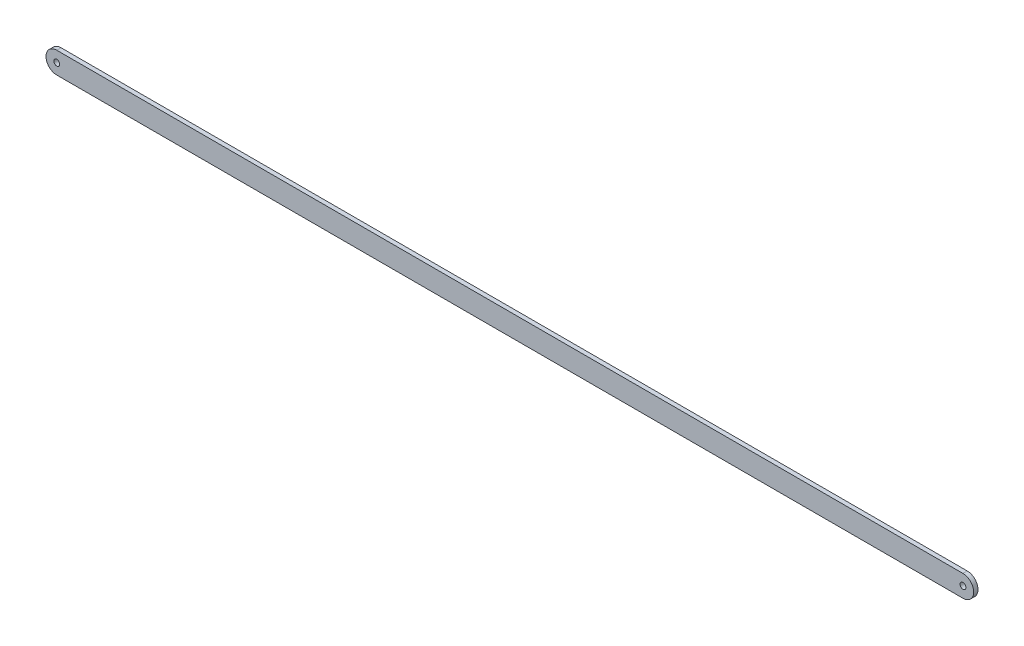
ISO-10303-21;
HEADER;
FILE_DESCRIPTION(('STEP AP214'),'2;1');
FILE_NAME('part.step','',(''),(''),'','','');
FILE_SCHEMA(('AUTOMOTIVE_DESIGN { 1 0 10303 214 1 1 1 1 }'));
ENDSEC;
DATA;
#1=APPLICATION_CONTEXT('core data for automotive mechanical design processes');
#2=APPLICATION_PROTOCOL_DEFINITION('international standard','automotive_design',2000,#1);
#3=PRODUCT_CONTEXT('',#1,'mechanical');
#4=PRODUCT('Part','Part','',(#3));
#5=PRODUCT_RELATED_PRODUCT_CATEGORY('part','',(#4));
#6=PRODUCT_DEFINITION_FORMATION('','',#4);
#7=PRODUCT_DEFINITION_CONTEXT('part definition',#1,'design');
#8=PRODUCT_DEFINITION('design','',#6,#7);
#9=PRODUCT_DEFINITION_SHAPE('','',#8);
#10=(LENGTH_UNIT() NAMED_UNIT(*) SI_UNIT(.MILLI.,.METRE.));
#11=(NAMED_UNIT(*) PLANE_ANGLE_UNIT() SI_UNIT($,.RADIAN.));
#12=(NAMED_UNIT(*) SI_UNIT($,.STERADIAN.) SOLID_ANGLE_UNIT());
#13=UNCERTAINTY_MEASURE_WITH_UNIT(LENGTH_MEASURE(1.E-05),#10,'distance_accuracy_value','');
#14=(GEOMETRIC_REPRESENTATION_CONTEXT(3) GLOBAL_UNCERTAINTY_ASSIGNED_CONTEXT((#13)) GLOBAL_UNIT_ASSIGNED_CONTEXT((#10,
#11,#12)) REPRESENTATION_CONTEXT('',''));
#15=CARTESIAN_POINT('',(0.,0.,0.));
#16=DIRECTION('',(0.,0.,1.));
#17=DIRECTION('',(1.,0.,0.));
#18=AXIS2_PLACEMENT_3D('',#15,#16,#17);
#19=CARTESIAN_POINT('',(421.355,0.,4.));
#20=DIRECTION('',(0.,0.,-1.));
#21=DIRECTION('',(-1.,0.,0.));
#22=AXIS2_PLACEMENT_3D('',#19,#20,#21);
#23=PLANE('',#22);
#24=CARTESIAN_POINT('',(421.355,0.,4.));
#25=DIRECTION('',(0.,0.,1.));
#26=DIRECTION('',(-1.,0.,0.));
#27=AXIS2_PLACEMENT_3D('',#24,#25,#26);
#28=CIRCLE('',#27,10.);
#29=CARTESIAN_POINT('',(421.355,-10.,4.));
#30=VERTEX_POINT('',#29);
#31=CARTESIAN_POINT('',(421.355,9.99999999999995,4.));
#32=VERTEX_POINT('',#31);
#33=EDGE_CURVE('E84',#30,#32,#28,.T.);
#34=ORIENTED_EDGE('',*,*,#33,.T.);
#35=DIRECTION('',(-1.,0.,0.));
#36=VECTOR('',#35,1.);
#37=CARTESIAN_POINT('',(-421.355,9.99999999999984,4.));
#38=LINE('',#37,#36);
#39=CARTESIAN_POINT('',(-421.355,9.99999999999984,4.));
#40=VERTEX_POINT('',#39);
#41=EDGE_CURVE('E79',#32,#40,#38,.T.);
#42=ORIENTED_EDGE('',*,*,#41,.T.);
#43=CARTESIAN_POINT('',(-421.355,-1.60642431554755E-13,4.));
#44=DIRECTION('',(0.,0.,1.));
#45=DIRECTION('',(1.,0.,0.));
#46=AXIS2_PLACEMENT_3D('',#43,#44,#45);
#47=CIRCLE('',#46,9.99999999999999);
#48=CARTESIAN_POINT('',(-421.355,-10.0000000000002,4.));
#49=VERTEX_POINT('',#48);
#50=EDGE_CURVE('E82',#40,#49,#47,.T.);
#51=ORIENTED_EDGE('',*,*,#50,.T.);
#52=DIRECTION('',(1.,0.,0.));
#53=VECTOR('',#52,1.);
#54=CARTESIAN_POINT('',(-421.355,-10.0000000000002,4.));
#55=LINE('',#54,#53);
#56=EDGE_CURVE('E49',#49,#30,#55,.T.);
#57=ORIENTED_EDGE('',*,*,#56,.T.);
#58=EDGE_LOOP('',(#34,#42,#51,#57));
#59=FACE_BOUND('',#58,.T.);
#60=CARTESIAN_POINT('',(-421.355,-1.60642431554755E-13,4.));
#61=DIRECTION('',(0.,0.,1.));
#62=DIRECTION('',(1.,0.,0.));
#63=AXIS2_PLACEMENT_3D('',#60,#61,#62);
#64=CIRCLE('',#63,2.75000000000004);
#65=CARTESIAN_POINT('',(-418.605,-1.60642431554755E-13,4.));
#66=VERTEX_POINT('',#65);
#67=EDGE_CURVE('E99',#66,#66,#64,.T.);
#68=ORIENTED_EDGE('',*,*,#67,.F.);
#69=EDGE_LOOP('',(#68));
#70=FACE_BOUND('',#69,.T.);
#71=CARTESIAN_POINT('',(421.355,0.,4.));
#72=DIRECTION('',(0.,0.,1.));
#73=DIRECTION('',(-1.,0.,0.));
#74=AXIS2_PLACEMENT_3D('',#71,#72,#73);
#75=CIRCLE('',#74,2.75000000000004);
#76=CARTESIAN_POINT('',(418.605,0.,4.));
#77=VERTEX_POINT('',#76);
#78=EDGE_CURVE('E114',#77,#77,#75,.T.);
#79=ORIENTED_EDGE('',*,*,#78,.F.);
#80=EDGE_LOOP('',(#79));
#81=FACE_BOUND('',#80,.T.);
#82=ADVANCED_FACE('F32',(#59,#70,#81),#23,.F.);
#83=CARTESIAN_POINT('',(421.355,0.,0.));
#84=DIRECTION('',(0.,0.,-1.));
#85=DIRECTION('',(-1.,0.,0.));
#86=AXIS2_PLACEMENT_3D('',#83,#84,#85);
#87=PLANE('',#86);
#88=CARTESIAN_POINT('',(-421.355,-1.60642431554755E-13,0.));
#89=DIRECTION('',(0.,0.,1.));
#90=DIRECTION('',(1.,0.,0.));
#91=AXIS2_PLACEMENT_3D('',#88,#89,#90);
#92=CIRCLE('',#91,2.75000000000004);
#93=CARTESIAN_POINT('',(-418.605,-1.60642431554755E-13,0.));
#94=VERTEX_POINT('',#93);
#95=EDGE_CURVE('E111',#94,#94,#92,.T.);
#96=ORIENTED_EDGE('',*,*,#95,.T.);
#97=EDGE_LOOP('',(#96));
#98=FACE_BOUND('',#97,.T.);
#99=CARTESIAN_POINT('',(421.355,0.,0.));
#100=DIRECTION('',(0.,0.,1.));
#101=DIRECTION('',(-1.,0.,0.));
#102=AXIS2_PLACEMENT_3D('',#99,#100,#101);
#103=CIRCLE('',#102,10.);
#104=CARTESIAN_POINT('',(421.355,-10.,0.));
#105=VERTEX_POINT('',#104);
#106=CARTESIAN_POINT('',(421.355,9.99999999999995,0.));
#107=VERTEX_POINT('',#106);
#108=EDGE_CURVE('E96',#105,#107,#103,.T.);
#109=ORIENTED_EDGE('',*,*,#108,.F.);
#110=DIRECTION('',(1.,0.,0.));
#111=VECTOR('',#110,1.);
#112=CARTESIAN_POINT('',(-421.355,-10.0000000000002,0.));
#113=LINE('',#112,#111);
#114=CARTESIAN_POINT('',(-421.355,-10.0000000000002,0.));
#115=VERTEX_POINT('',#114);
#116=EDGE_CURVE('E72',#115,#105,#113,.T.);
#117=ORIENTED_EDGE('',*,*,#116,.F.);
#118=CARTESIAN_POINT('',(-421.355,-1.60642431554755E-13,0.));
#119=DIRECTION('',(0.,0.,1.));
#120=DIRECTION('',(1.,0.,0.));
#121=AXIS2_PLACEMENT_3D('',#118,#119,#120);
#122=CIRCLE('',#121,9.99999999999999);
#123=CARTESIAN_POINT('',(-421.355,9.99999999999984,0.));
#124=VERTEX_POINT('',#123);
#125=EDGE_CURVE('E66',#124,#115,#122,.T.);
#126=ORIENTED_EDGE('',*,*,#125,.F.);
#127=DIRECTION('',(-1.,0.,0.));
#128=VECTOR('',#127,1.);
#129=CARTESIAN_POINT('',(-421.355,9.99999999999984,0.));
#130=LINE('',#129,#128);
#131=EDGE_CURVE('E88',#107,#124,#130,.T.);
#132=ORIENTED_EDGE('',*,*,#131,.F.);
#133=EDGE_LOOP('',(#109,#117,#126,#132));
#134=FACE_BOUND('',#133,.T.);
#135=CARTESIAN_POINT('',(421.355,0.,0.));
#136=DIRECTION('',(0.,0.,1.));
#137=DIRECTION('',(-1.,0.,0.));
#138=AXIS2_PLACEMENT_3D('',#135,#136,#137);
#139=CIRCLE('',#138,2.75000000000004);
#140=CARTESIAN_POINT('',(418.605,0.,0.));
#141=VERTEX_POINT('',#140);
#142=EDGE_CURVE('E117',#141,#141,#139,.T.);
#143=ORIENTED_EDGE('',*,*,#142,.T.);
#144=EDGE_LOOP('',(#143));
#145=FACE_BOUND('',#144,.T.);
#146=ADVANCED_FACE('F107',(#98,#134,#145),#87,.T.);
#147=CARTESIAN_POINT('',(421.355,0.,4.));
#148=DIRECTION('',(0.,0.,-1.));
#149=DIRECTION('',(-1.,0.,0.));
#150=AXIS2_PLACEMENT_3D('',#147,#148,#149);
#151=CYLINDRICAL_SURFACE('',#150,10.);
#152=ORIENTED_EDGE('',*,*,#108,.T.);
#153=DIRECTION('',(0.,0.,-1.));
#154=VECTOR('',#153,1.);
#155=CARTESIAN_POINT('',(421.355,9.99999999999995,4.));
#156=LINE('',#155,#154);
#157=EDGE_CURVE('E11',#32,#107,#156,.T.);
#158=ORIENTED_EDGE('',*,*,#157,.F.);
#159=ORIENTED_EDGE('',*,*,#33,.F.);
#160=DIRECTION('',(0.,0.,-1.));
#161=VECTOR('',#160,1.);
#162=CARTESIAN_POINT('',(421.355,-10.,4.));
#163=LINE('',#162,#161);
#164=EDGE_CURVE('E92',#30,#105,#163,.T.);
#165=ORIENTED_EDGE('',*,*,#164,.T.);
#166=EDGE_LOOP('',(#152,#158,#159,#165));
#167=FACE_BOUND('',#166,.T.);
#168=ADVANCED_FACE('F34',(#167),#151,.T.);
#169=CARTESIAN_POINT('',(-421.355,9.99999999999984,4.));
#170=DIRECTION('',(0.,-1.,0.));
#171=DIRECTION('',(1.,0.,0.));
#172=AXIS2_PLACEMENT_3D('',#169,#170,#171);
#173=PLANE('',#172);
#174=ORIENTED_EDGE('',*,*,#131,.T.);
#175=DIRECTION('',(0.,0.,-1.));
#176=VECTOR('',#175,1.);
#177=CARTESIAN_POINT('',(-421.355,9.99999999999984,4.));
#178=LINE('',#177,#176);
#179=EDGE_CURVE('E41',#40,#124,#178,.T.);
#180=ORIENTED_EDGE('',*,*,#179,.F.);
#181=ORIENTED_EDGE('',*,*,#41,.F.);
#182=ORIENTED_EDGE('',*,*,#157,.T.);
#183=EDGE_LOOP('',(#174,#180,#181,#182));
#184=FACE_BOUND('',#183,.T.);
#185=ADVANCED_FACE('F87',(#184),#173,.F.);
#186=CARTESIAN_POINT('',(-421.355,-1.60642431554755E-13,4.));
#187=DIRECTION('',(0.,0.,-1.));
#188=DIRECTION('',(-1.,0.,0.));
#189=AXIS2_PLACEMENT_3D('',#186,#187,#188);
#190=CYLINDRICAL_SURFACE('',#189,9.99999999999999);
#191=ORIENTED_EDGE('',*,*,#125,.T.);
#192=DIRECTION('',(0.,0.,-1.));
#193=VECTOR('',#192,1.);
#194=CARTESIAN_POINT('',(-421.355,-10.0000000000002,4.));
#195=LINE('',#194,#193);
#196=EDGE_CURVE('E89',#49,#115,#195,.T.);
#197=ORIENTED_EDGE('',*,*,#196,.F.);
#198=ORIENTED_EDGE('',*,*,#50,.F.);
#199=ORIENTED_EDGE('',*,*,#179,.T.);
#200=EDGE_LOOP('',(#191,#197,#198,#199));
#201=FACE_BOUND('',#200,.T.);
#202=ADVANCED_FACE('F90',(#201),#190,.T.);
#203=CARTESIAN_POINT('',(-421.355,-10.0000000000002,4.));
#204=DIRECTION('',(0.,1.,0.));
#205=DIRECTION('',(-1.,0.,0.));
#206=AXIS2_PLACEMENT_3D('',#203,#204,#205);
#207=PLANE('',#206);
#208=ORIENTED_EDGE('',*,*,#116,.T.);
#209=ORIENTED_EDGE('',*,*,#164,.F.);
#210=ORIENTED_EDGE('',*,*,#56,.F.);
#211=ORIENTED_EDGE('',*,*,#196,.T.);
#212=EDGE_LOOP('',(#208,#209,#210,#211));
#213=FACE_BOUND('',#212,.T.);
#214=ADVANCED_FACE('F104',(#213),#207,.F.);
#215=CARTESIAN_POINT('',(-421.355,-1.60642431554755E-13,4.));
#216=DIRECTION('',(0.,0.,-1.));
#217=DIRECTION('',(-1.,0.,0.));
#218=AXIS2_PLACEMENT_3D('',#215,#216,#217);
#219=CYLINDRICAL_SURFACE('',#218,2.75000000000004);
#220=ORIENTED_EDGE('',*,*,#67,.T.);
#221=EDGE_LOOP('',(#220));
#222=FACE_BOUND('',#221,.T.);
#223=ORIENTED_EDGE('',*,*,#95,.F.);
#224=EDGE_LOOP('',(#223));
#225=FACE_BOUND('',#224,.T.);
#226=ADVANCED_FACE('F134',(#222,#225),#219,.F.);
#227=CARTESIAN_POINT('',(421.355,0.,4.));
#228=DIRECTION('',(0.,0.,-1.));
#229=DIRECTION('',(-1.,0.,0.));
#230=AXIS2_PLACEMENT_3D('',#227,#228,#229);
#231=CYLINDRICAL_SURFACE('',#230,2.75000000000004);
#232=ORIENTED_EDGE('',*,*,#78,.T.);
#233=EDGE_LOOP('',(#232));
#234=FACE_BOUND('',#233,.T.);
#235=ORIENTED_EDGE('',*,*,#142,.F.);
#236=EDGE_LOOP('',(#235));
#237=FACE_BOUND('',#236,.T.);
#238=ADVANCED_FACE('F123',(#234,#237),#231,.F.);
#239=CLOSED_SHELL('',(#82,#146,#168,#185,#202,#214,#226,#238));
#240=MANIFOLD_SOLID_BREP('B2',#239);
#241=ADVANCED_BREP_SHAPE_REPRESENTATION('',(#18,#240),#14);
#242=SHAPE_DEFINITION_REPRESENTATION(#9,#241);
ENDSEC;
END-ISO-10303-21;
